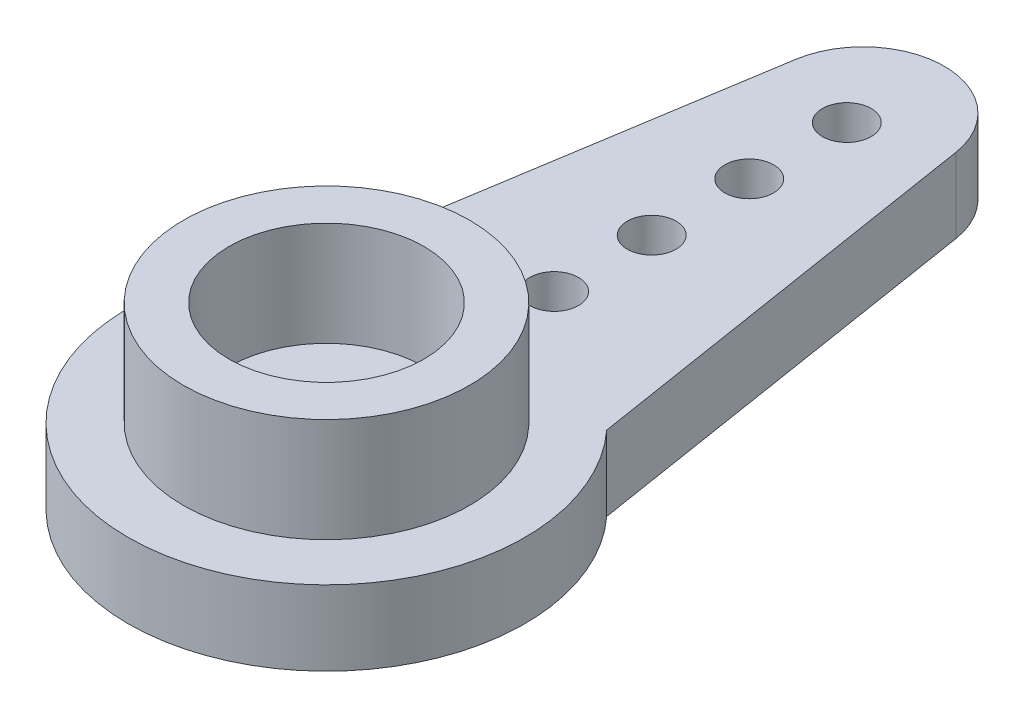
ISO-10303-21;
HEADER;
FILE_DESCRIPTION(('STEP AP214'),'2;1');
FILE_NAME('part.step','',(''),(''),'','','');
FILE_SCHEMA(('AUTOMOTIVE_DESIGN { 1 0 10303 214 1 1 1 1 }'));
ENDSEC;
DATA;
#1=APPLICATION_CONTEXT('core data for automotive mechanical design processes');
#2=APPLICATION_PROTOCOL_DEFINITION('international standard','automotive_design',2000,#1);
#3=PRODUCT_CONTEXT('',#1,'mechanical');
#4=PRODUCT('Part','Part','',(#3));
#5=PRODUCT_RELATED_PRODUCT_CATEGORY('part','',(#4));
#6=PRODUCT_DEFINITION_FORMATION('','',#4);
#7=PRODUCT_DEFINITION_CONTEXT('part definition',#1,'design');
#8=PRODUCT_DEFINITION('design','',#6,#7);
#9=PRODUCT_DEFINITION_SHAPE('','',#8);
#10=(LENGTH_UNIT() NAMED_UNIT(*) SI_UNIT(.MILLI.,.METRE.));
#11=(NAMED_UNIT(*) PLANE_ANGLE_UNIT() SI_UNIT($,.RADIAN.));
#12=(NAMED_UNIT(*) SI_UNIT($,.STERADIAN.) SOLID_ANGLE_UNIT());
#13=UNCERTAINTY_MEASURE_WITH_UNIT(LENGTH_MEASURE(1.E-05),#10,'distance_accuracy_value','');
#14=(GEOMETRIC_REPRESENTATION_CONTEXT(3) GLOBAL_UNCERTAINTY_ASSIGNED_CONTEXT((#13)) GLOBAL_UNIT_ASSIGNED_CONTEXT((#10,
#11,#12)) REPRESENTATION_CONTEXT('',''));
#15=CARTESIAN_POINT('',(0.,0.,0.));
#16=DIRECTION('',(0.,0.,1.));
#17=DIRECTION('',(1.,0.,0.));
#18=AXIS2_PLACEMENT_3D('',#15,#16,#17);
#19=CARTESIAN_POINT('',(0.,2.3,0.));
#20=DIRECTION('',(0.,1.,0.));
#21=DIRECTION('',(0.,0.,1.));
#22=AXIS2_PLACEMENT_3D('',#19,#20,#21);
#23=PLANE('',#22);
#24=CARTESIAN_POINT('',(0.,2.3,0.));
#25=DIRECTION('',(0.,1.,0.));
#26=DIRECTION('',(0.,0.,1.));
#27=AXIS2_PLACEMENT_3D('',#24,#25,#26);
#28=CIRCLE('',#27,1.5);
#29=CARTESIAN_POINT('',(0.,2.3,1.5));
#30=VERTEX_POINT('',#29);
#31=EDGE_CURVE('E137',#30,#30,#28,.T.);
#32=ORIENTED_EDGE('',*,*,#31,.F.);
#33=EDGE_LOOP('',(#32));
#34=FACE_BOUND('',#33,.T.);
#35=CARTESIAN_POINT('',(0.,2.3,0.));
#36=DIRECTION('',(0.,1.,0.));
#37=DIRECTION('',(0.,0.,1.));
#38=AXIS2_PLACEMENT_3D('',#35,#36,#37);
#39=CIRCLE('',#38,3.);
#40=CARTESIAN_POINT('',(0.,2.3,3.));
#41=VERTEX_POINT('',#40);
#42=EDGE_CURVE('E125',#41,#41,#39,.T.);
#43=ORIENTED_EDGE('',*,*,#42,.T.);
#44=EDGE_LOOP('',(#43));
#45=FACE_BOUND('',#44,.T.);
#46=ADVANCED_FACE('F36',(#34,#45),#23,.T.);
#47=CARTESIAN_POINT('',(0.,2.3,0.));
#48=DIRECTION('',(0.,1.,0.));
#49=DIRECTION('',(0.,0.,1.));
#50=AXIS2_PLACEMENT_3D('',#47,#48,#49);
#51=CIRCLE('',#50,4.4);
#52=CARTESIAN_POINT('',(0.,2.3,4.4));
#53=VERTEX_POINT('',#52);
#54=EDGE_CURVE('E11',#53,#53,#51,.T.);
#55=ORIENTED_EDGE('',*,*,#54,.F.);
#56=EDGE_LOOP('',(#55));
#57=FACE_BOUND('',#56,.T.);
#58=CARTESIAN_POINT('',(0.,2.3,0.));
#59=DIRECTION('',(0.,1.,0.));
#60=DIRECTION('',(0.,0.,1.));
#61=AXIS2_PLACEMENT_3D('',#58,#59,#60);
#62=CIRCLE('',#61,6.1);
#63=CARTESIAN_POINT('',(-4.5,2.3,-4.1182520563948));
#64=VERTEX_POINT('',#63);
#65=CARTESIAN_POINT('',(4.5,2.3,-4.1182520563948));
#66=VERTEX_POINT('',#65);
#67=EDGE_CURVE('E45',#64,#66,#62,.T.);
#68=ORIENTED_EDGE('',*,*,#67,.T.);
#69=DIRECTION('',(0.157019797021949,0.,0.987595455307074));
#70=VECTOR('',#69,1.);
#71=CARTESIAN_POINT('',(5.02767726414761,2.3,-0.799360567392308));
#72=LINE('',#71,#70);
#73=CARTESIAN_POINT('',(2.46898863826769,2.3,-16.8925494925549));
#74=VERTEX_POINT('',#73);
#75=EDGE_CURVE('E99',#74,#66,#72,.T.);
#76=ORIENTED_EDGE('',*,*,#75,.F.);
#77=CARTESIAN_POINT('',(0.,2.3,-16.5));
#78=DIRECTION('',(0.,-1.,0.));
#79=DIRECTION('',(0.,0.,-1.));
#80=AXIS2_PLACEMENT_3D('',#77,#78,#79);
#81=CIRCLE('',#80,2.5);
#82=CARTESIAN_POINT('',(-2.46898863826768,2.3,-16.8925494925549));
#83=VERTEX_POINT('',#82);
#84=EDGE_CURVE('E80',#83,#74,#81,.T.);
#85=ORIENTED_EDGE('',*,*,#84,.F.);
#86=DIRECTION('',(-0.15701979702195,0.,0.987595455307073));
#87=VECTOR('',#86,1.);
#88=CARTESIAN_POINT('',(-5.02767726414761,2.3,-0.799360567392309));
#89=LINE('',#88,#87);
#90=EDGE_CURVE('E91',#83,#64,#89,.T.);
#91=ORIENTED_EDGE('',*,*,#90,.T.);
#92=EDGE_LOOP('',(#68,#76,#85,#91));
#93=FACE_BOUND('',#92,.T.);
#94=CARTESIAN_POINT('',(0.,2.3,-7.));
#95=DIRECTION('',(0.,-1.,0.));
#96=DIRECTION('',(0.,0.,-1.));
#97=AXIS2_PLACEMENT_3D('',#94,#95,#96);
#98=CIRCLE('',#97,0.75);
#99=CARTESIAN_POINT('',(0.,2.3,-7.75));
#100=VERTEX_POINT('',#99);
#101=EDGE_CURVE('E122',#100,#100,#98,.T.);
#102=ORIENTED_EDGE('',*,*,#101,.T.);
#103=EDGE_LOOP('',(#102));
#104=FACE_BOUND('',#103,.T.);
#105=CARTESIAN_POINT('',(0.,2.3,-10.));
#106=DIRECTION('',(0.,-1.,0.));
#107=DIRECTION('',(0.,0.,-1.));
#108=AXIS2_PLACEMENT_3D('',#105,#106,#107);
#109=CIRCLE('',#108,0.750000000000001);
#110=CARTESIAN_POINT('',(0.,2.3,-10.75));
#111=VERTEX_POINT('',#110);
#112=EDGE_CURVE('E304',#111,#111,#109,.T.);
#113=ORIENTED_EDGE('',*,*,#112,.T.);
#114=EDGE_LOOP('',(#113));
#115=FACE_BOUND('',#114,.T.);
#116=CARTESIAN_POINT('',(0.,2.3,-13.));
#117=DIRECTION('',(0.,-1.,0.));
#118=DIRECTION('',(0.,0.,-1.));
#119=AXIS2_PLACEMENT_3D('',#116,#117,#118);
#120=CIRCLE('',#119,0.750000000000001);
#121=CARTESIAN_POINT('',(0.,2.3,-13.75));
#122=VERTEX_POINT('',#121);
#123=EDGE_CURVE('E302',#122,#122,#120,.T.);
#124=ORIENTED_EDGE('',*,*,#123,.T.);
#125=EDGE_LOOP('',(#124));
#126=FACE_BOUND('',#125,.T.);
#127=CARTESIAN_POINT('',(0.,2.3,-16.));
#128=DIRECTION('',(0.,-1.,0.));
#129=DIRECTION('',(0.,0.,-1.));
#130=AXIS2_PLACEMENT_3D('',#127,#128,#129);
#131=CIRCLE('',#130,0.75);
#132=CARTESIAN_POINT('',(0.,2.3,-16.75));
#133=VERTEX_POINT('',#132);
#134=EDGE_CURVE('E94',#133,#133,#131,.T.);
#135=ORIENTED_EDGE('',*,*,#134,.T.);
#136=EDGE_LOOP('',(#135));
#137=FACE_BOUND('',#136,.T.);
#138=ADVANCED_FACE('F96',(#57,#93,#104,#115,#126,#137),#23,.T.);
#139=CARTESIAN_POINT('',(0.,0.,0.));
#140=DIRECTION('',(0.,1.,0.));
#141=DIRECTION('',(0.,0.,1.));
#142=AXIS2_PLACEMENT_3D('',#139,#140,#141);
#143=PLANE('',#142);
#144=CARTESIAN_POINT('',(0.,0.,0.));
#145=DIRECTION('',(0.,1.,0.));
#146=DIRECTION('',(0.,0.,1.));
#147=AXIS2_PLACEMENT_3D('',#144,#145,#146);
#148=CIRCLE('',#147,6.1);
#149=CARTESIAN_POINT('',(-4.5,0.,-4.1182520563948));
#150=VERTEX_POINT('',#149);
#151=CARTESIAN_POINT('',(4.5,0.,-4.1182520563948));
#152=VERTEX_POINT('',#151);
#153=EDGE_CURVE('E40',#150,#152,#148,.T.);
#154=ORIENTED_EDGE('',*,*,#153,.F.);
#155=DIRECTION('',(-0.15701979702195,0.,0.987595455307073));
#156=VECTOR('',#155,1.);
#157=CARTESIAN_POINT('',(-5.02767726414761,0.,-0.799360567392309));
#158=LINE('',#157,#156);
#159=CARTESIAN_POINT('',(-2.46898863826768,0.,-16.8925494925549));
#160=VERTEX_POINT('',#159);
#161=EDGE_CURVE('E116',#160,#150,#158,.T.);
#162=ORIENTED_EDGE('',*,*,#161,.F.);
#163=CARTESIAN_POINT('',(0.,0.,-16.5));
#164=DIRECTION('',(0.,-1.,0.));
#165=DIRECTION('',(0.,0.,-1.));
#166=AXIS2_PLACEMENT_3D('',#163,#164,#165);
#167=CIRCLE('',#166,2.5);
#168=CARTESIAN_POINT('',(2.46898863826769,0.,-16.8925494925549));
#169=VERTEX_POINT('',#168);
#170=EDGE_CURVE('E83',#160,#169,#167,.T.);
#171=ORIENTED_EDGE('',*,*,#170,.T.);
#172=DIRECTION('',(0.157019797021949,0.,0.987595455307074));
#173=VECTOR('',#172,1.);
#174=CARTESIAN_POINT('',(5.02767726414761,0.,-0.799360567392308));
#175=LINE('',#174,#173);
#176=EDGE_CURVE('E119',#169,#152,#175,.T.);
#177=ORIENTED_EDGE('',*,*,#176,.T.);
#178=EDGE_LOOP('',(#154,#162,#171,#177));
#179=FACE_BOUND('',#178,.T.);
#180=CARTESIAN_POINT('',(0.,0.,0.));
#181=DIRECTION('',(0.,1.,0.));
#182=DIRECTION('',(0.,0.,1.));
#183=AXIS2_PLACEMENT_3D('',#180,#181,#182);
#184=CIRCLE('',#183,1.5);
#185=CARTESIAN_POINT('',(0.,0.,1.5));
#186=VERTEX_POINT('',#185);
#187=EDGE_CURVE('E135',#186,#186,#184,.T.);
#188=ORIENTED_EDGE('',*,*,#187,.T.);
#189=EDGE_LOOP('',(#188));
#190=FACE_BOUND('',#189,.T.);
#191=CARTESIAN_POINT('',(0.,0.,-7.));
#192=DIRECTION('',(0.,-1.,0.));
#193=DIRECTION('',(0.,0.,-1.));
#194=AXIS2_PLACEMENT_3D('',#191,#192,#193);
#195=CIRCLE('',#194,0.75);
#196=CARTESIAN_POINT('',(0.,0.,-7.75));
#197=VERTEX_POINT('',#196);
#198=EDGE_CURVE('E104',#197,#197,#195,.T.);
#199=ORIENTED_EDGE('',*,*,#198,.F.);
#200=EDGE_LOOP('',(#199));
#201=FACE_BOUND('',#200,.T.);
#202=CARTESIAN_POINT('',(0.,0.,-10.));
#203=DIRECTION('',(0.,-1.,0.));
#204=DIRECTION('',(0.,0.,-1.));
#205=AXIS2_PLACEMENT_3D('',#202,#203,#204);
#206=CIRCLE('',#205,0.750000000000001);
#207=CARTESIAN_POINT('',(0.,0.,-10.75));
#208=VERTEX_POINT('',#207);
#209=EDGE_CURVE('E107',#208,#208,#206,.T.);
#210=ORIENTED_EDGE('',*,*,#209,.F.);
#211=EDGE_LOOP('',(#210));
#212=FACE_BOUND('',#211,.T.);
#213=CARTESIAN_POINT('',(0.,0.,-13.));
#214=DIRECTION('',(0.,-1.,0.));
#215=DIRECTION('',(0.,0.,-1.));
#216=AXIS2_PLACEMENT_3D('',#213,#214,#215);
#217=CIRCLE('',#216,0.750000000000001);
#218=CARTESIAN_POINT('',(0.,0.,-13.75));
#219=VERTEX_POINT('',#218);
#220=EDGE_CURVE('E110',#219,#219,#217,.T.);
#221=ORIENTED_EDGE('',*,*,#220,.F.);
#222=EDGE_LOOP('',(#221));
#223=FACE_BOUND('',#222,.T.);
#224=CARTESIAN_POINT('',(0.,0.,-16.));
#225=DIRECTION('',(0.,-1.,0.));
#226=DIRECTION('',(0.,0.,-1.));
#227=AXIS2_PLACEMENT_3D('',#224,#225,#226);
#228=CIRCLE('',#227,0.75);
#229=CARTESIAN_POINT('',(0.,0.,-16.75));
#230=VERTEX_POINT('',#229);
#231=EDGE_CURVE('E113',#230,#230,#228,.T.);
#232=ORIENTED_EDGE('',*,*,#231,.F.);
#233=EDGE_LOOP('',(#232));
#234=FACE_BOUND('',#233,.T.);
#235=ADVANCED_FACE('F145',(#179,#190,#201,#212,#223,#234),#143,.F.);
#236=CARTESIAN_POINT('',(0.,2.3,0.));
#237=DIRECTION('',(0.,-1.,0.));
#238=DIRECTION('',(0.,0.,-1.));
#239=AXIS2_PLACEMENT_3D('',#236,#237,#238);
#240=CYLINDRICAL_SURFACE('',#239,6.1);
#241=ORIENTED_EDGE('',*,*,#153,.T.);
#242=DIRECTION('',(0.,-1.,0.));
#243=VECTOR('',#242,1.);
#244=CARTESIAN_POINT('',(4.5,2.3,-4.1182520563948));
#245=LINE('',#244,#243);
#246=EDGE_CURVE('E123',#66,#152,#245,.T.);
#247=ORIENTED_EDGE('',*,*,#246,.F.);
#248=ORIENTED_EDGE('',*,*,#67,.F.);
#249=DIRECTION('',(0.,-1.,0.));
#250=VECTOR('',#249,1.);
#251=CARTESIAN_POINT('',(-4.5,2.3,-4.1182520563948));
#252=LINE('',#251,#250);
#253=EDGE_CURVE('E88',#64,#150,#252,.T.);
#254=ORIENTED_EDGE('',*,*,#253,.T.);
#255=EDGE_LOOP('',(#241,#247,#248,#254));
#256=FACE_BOUND('',#255,.T.);
#257=ADVANCED_FACE('F38',(#256),#240,.T.);
#258=CARTESIAN_POINT('',(0.,2.3,0.));
#259=DIRECTION('',(0.,-1.,0.));
#260=DIRECTION('',(0.,0.,-1.));
#261=AXIS2_PLACEMENT_3D('',#258,#259,#260);
#262=CYLINDRICAL_SURFACE('',#261,1.5);
#263=ORIENTED_EDGE('',*,*,#31,.T.);
#264=EDGE_LOOP('',(#263));
#265=FACE_BOUND('',#264,.T.);
#266=ORIENTED_EDGE('',*,*,#187,.F.);
#267=EDGE_LOOP('',(#266));
#268=FACE_BOUND('',#267,.T.);
#269=ADVANCED_FACE('F148',(#265,#268),#262,.F.);
#270=CARTESIAN_POINT('',(0.,5.5,0.));
#271=DIRECTION('',(0.,1.,0.));
#272=DIRECTION('',(0.,0.,1.));
#273=AXIS2_PLACEMENT_3D('',#270,#271,#272);
#274=PLANE('',#273);
#275=CARTESIAN_POINT('',(0.,5.5,0.));
#276=DIRECTION('',(0.,1.,0.));
#277=DIRECTION('',(0.,0.,1.));
#278=AXIS2_PLACEMENT_3D('',#275,#276,#277);
#279=CIRCLE('',#278,4.4);
#280=CARTESIAN_POINT('',(0.,5.5,4.4));
#281=VERTEX_POINT('',#280);
#282=EDGE_CURVE('E131',#281,#281,#279,.T.);
#283=ORIENTED_EDGE('',*,*,#282,.T.);
#284=EDGE_LOOP('',(#283));
#285=FACE_BOUND('',#284,.T.);
#286=CARTESIAN_POINT('',(0.,5.5,0.));
#287=DIRECTION('',(0.,1.,0.));
#288=DIRECTION('',(0.,0.,1.));
#289=AXIS2_PLACEMENT_3D('',#286,#287,#288);
#290=CIRCLE('',#289,3.);
#291=CARTESIAN_POINT('',(0.,5.5,3.));
#292=VERTEX_POINT('',#291);
#293=EDGE_CURVE('E128',#292,#292,#290,.T.);
#294=ORIENTED_EDGE('',*,*,#293,.F.);
#295=EDGE_LOOP('',(#294));
#296=FACE_BOUND('',#295,.T.);
#297=ADVANCED_FACE('F153',(#285,#296),#274,.T.);
#298=CARTESIAN_POINT('',(0.,5.5,0.));
#299=DIRECTION('',(0.,-1.,0.));
#300=DIRECTION('',(0.,0.,-1.));
#301=AXIS2_PLACEMENT_3D('',#298,#299,#300);
#302=CYLINDRICAL_SURFACE('',#301,4.4);
#303=ORIENTED_EDGE('',*,*,#282,.F.);
#304=EDGE_LOOP('',(#303));
#305=FACE_BOUND('',#304,.T.);
#306=ORIENTED_EDGE('',*,*,#54,.T.);
#307=EDGE_LOOP('',(#306));
#308=FACE_BOUND('',#307,.T.);
#309=ADVANCED_FACE('F166',(#305,#308),#302,.T.);
#310=CARTESIAN_POINT('',(0.,5.5,0.));
#311=DIRECTION('',(0.,-1.,0.));
#312=DIRECTION('',(0.,0.,-1.));
#313=AXIS2_PLACEMENT_3D('',#310,#311,#312);
#314=CYLINDRICAL_SURFACE('',#313,3.);
#315=ORIENTED_EDGE('',*,*,#293,.T.);
#316=EDGE_LOOP('',(#315));
#317=FACE_BOUND('',#316,.T.);
#318=ORIENTED_EDGE('',*,*,#42,.F.);
#319=EDGE_LOOP('',(#318));
#320=FACE_BOUND('',#319,.T.);
#321=ADVANCED_FACE('F169',(#317,#320),#314,.F.);
#322=CARTESIAN_POINT('',(5.02767726414761,2.3,-0.799360567392308));
#323=DIRECTION('',(0.987595455307073,0.,-0.157019797021949));
#324=DIRECTION('',(-0.157019797021949,0.,-0.987595455307074));
#325=AXIS2_PLACEMENT_3D('',#322,#323,#324);
#326=PLANE('',#325);
#327=ORIENTED_EDGE('',*,*,#176,.F.);
#328=DIRECTION('',(0.,-1.,0.));
#329=VECTOR('',#328,1.);
#330=CARTESIAN_POINT('',(2.46898863826769,2.3,-16.8925494925549));
#331=LINE('',#330,#329);
#332=EDGE_CURVE('E87',#74,#169,#331,.T.);
#333=ORIENTED_EDGE('',*,*,#332,.F.);
#334=ORIENTED_EDGE('',*,*,#75,.T.);
#335=ORIENTED_EDGE('',*,*,#246,.T.);
#336=EDGE_LOOP('',(#327,#333,#334,#335));
#337=FACE_BOUND('',#336,.T.);
#338=ADVANCED_FACE('F143',(#337),#326,.T.);
#339=CARTESIAN_POINT('',(0.,2.3,-16.5));
#340=DIRECTION('',(0.,-1.,0.));
#341=DIRECTION('',(0.,0.,-1.));
#342=AXIS2_PLACEMENT_3D('',#339,#340,#341);
#343=CYLINDRICAL_SURFACE('',#342,2.5);
#344=ORIENTED_EDGE('',*,*,#170,.F.);
#345=DIRECTION('',(0.,-1.,0.));
#346=VECTOR('',#345,1.);
#347=CARTESIAN_POINT('',(-2.46898863826768,2.3,-16.8925494925549));
#348=LINE('',#347,#346);
#349=EDGE_CURVE('E76',#83,#160,#348,.T.);
#350=ORIENTED_EDGE('',*,*,#349,.F.);
#351=ORIENTED_EDGE('',*,*,#84,.T.);
#352=ORIENTED_EDGE('',*,*,#332,.T.);
#353=EDGE_LOOP('',(#344,#350,#351,#352));
#354=FACE_BOUND('',#353,.T.);
#355=ADVANCED_FACE('F78',(#354),#343,.T.);
#356=CARTESIAN_POINT('',(0.,2.3,-16.));
#357=DIRECTION('',(0.,-1.,0.));
#358=DIRECTION('',(0.,0.,-1.));
#359=AXIS2_PLACEMENT_3D('',#356,#357,#358);
#360=CYLINDRICAL_SURFACE('',#359,0.75);
#361=ORIENTED_EDGE('',*,*,#134,.F.);
#362=EDGE_LOOP('',(#361));
#363=FACE_BOUND('',#362,.T.);
#364=ORIENTED_EDGE('',*,*,#231,.T.);
#365=EDGE_LOOP('',(#364));
#366=FACE_BOUND('',#365,.T.);
#367=ADVANCED_FACE('F188',(#363,#366),#360,.F.);
#368=CARTESIAN_POINT('',(0.,2.3,-13.));
#369=DIRECTION('',(0.,-1.,0.));
#370=DIRECTION('',(0.,0.,-1.));
#371=AXIS2_PLACEMENT_3D('',#368,#369,#370);
#372=CYLINDRICAL_SURFACE('',#371,0.750000000000001);
#373=ORIENTED_EDGE('',*,*,#123,.F.);
#374=EDGE_LOOP('',(#373));
#375=FACE_BOUND('',#374,.T.);
#376=ORIENTED_EDGE('',*,*,#220,.T.);
#377=EDGE_LOOP('',(#376));
#378=FACE_BOUND('',#377,.T.);
#379=ADVANCED_FACE('F184',(#375,#378),#372,.F.);
#380=CARTESIAN_POINT('',(0.,2.3,-10.));
#381=DIRECTION('',(0.,-1.,0.));
#382=DIRECTION('',(0.,0.,-1.));
#383=AXIS2_PLACEMENT_3D('',#380,#381,#382);
#384=CYLINDRICAL_SURFACE('',#383,0.750000000000001);
#385=ORIENTED_EDGE('',*,*,#112,.F.);
#386=EDGE_LOOP('',(#385));
#387=FACE_BOUND('',#386,.T.);
#388=ORIENTED_EDGE('',*,*,#209,.T.);
#389=EDGE_LOOP('',(#388));
#390=FACE_BOUND('',#389,.T.);
#391=ADVANCED_FACE('F180',(#387,#390),#384,.F.);
#392=CARTESIAN_POINT('',(0.,2.3,-7.));
#393=DIRECTION('',(0.,-1.,0.));
#394=DIRECTION('',(0.,0.,-1.));
#395=AXIS2_PLACEMENT_3D('',#392,#393,#394);
#396=CYLINDRICAL_SURFACE('',#395,0.75);
#397=ORIENTED_EDGE('',*,*,#101,.F.);
#398=EDGE_LOOP('',(#397));
#399=FACE_BOUND('',#398,.T.);
#400=ORIENTED_EDGE('',*,*,#198,.T.);
#401=EDGE_LOOP('',(#400));
#402=FACE_BOUND('',#401,.T.);
#403=ADVANCED_FACE('F177',(#399,#402),#396,.F.);
#404=CARTESIAN_POINT('',(-5.02767726414761,2.3,-0.799360567392309));
#405=DIRECTION('',(0.987595455307073,0.,0.15701979702195));
#406=DIRECTION('',(0.15701979702195,0.,-0.987595455307073));
#407=AXIS2_PLACEMENT_3D('',#404,#405,#406);
#408=PLANE('',#407);
#409=ORIENTED_EDGE('',*,*,#161,.T.);
#410=ORIENTED_EDGE('',*,*,#253,.F.);
#411=ORIENTED_EDGE('',*,*,#90,.F.);
#412=ORIENTED_EDGE('',*,*,#349,.T.);
#413=EDGE_LOOP('',(#409,#410,#411,#412));
#414=FACE_BOUND('',#413,.T.);
#415=ADVANCED_FACE('F92',(#414),#408,.F.);
#416=CLOSED_SHELL('',(#46,#138,#235,#257,#269,#297,#309,#321,#338,#355,#367,#379,#391,#403,#415));
#417=MANIFOLD_SOLID_BREP('B2',#416);
#418=ADVANCED_BREP_SHAPE_REPRESENTATION('',(#18,#417),#14);
#419=SHAPE_DEFINITION_REPRESENTATION(#9,#418);
ENDSEC;
END-ISO-10303-21;
